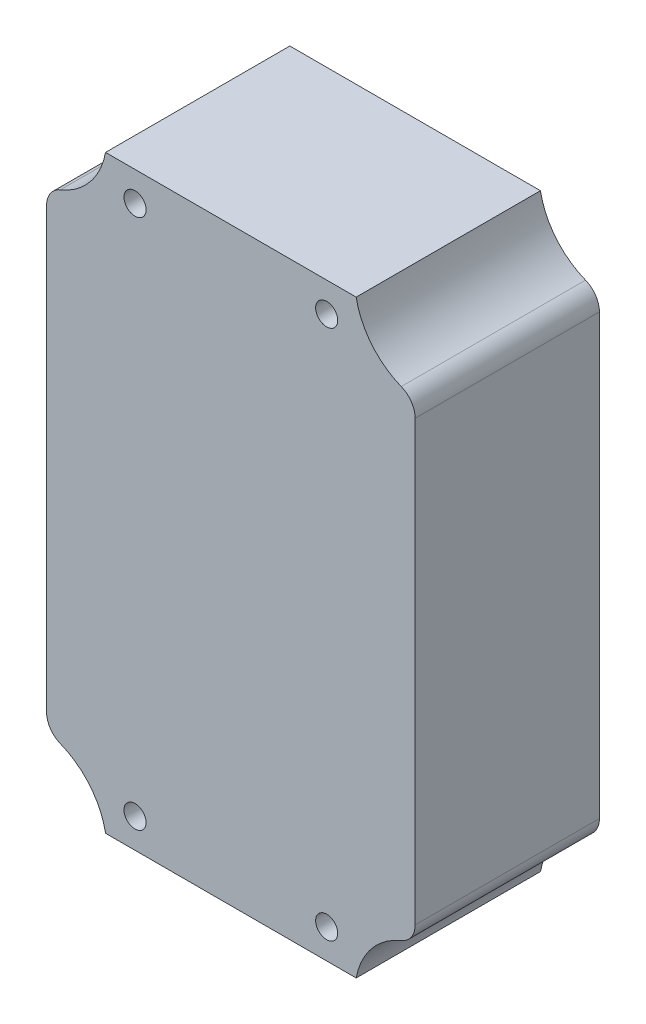
ISO-10303-21;
HEADER;
FILE_DESCRIPTION(('STEP AP214'),'2;1');
FILE_NAME('part.step','',(''),(''),'','','');
FILE_SCHEMA(('AUTOMOTIVE_DESIGN { 1 0 10303 214 1 1 1 1 }'));
ENDSEC;
DATA;
#1=APPLICATION_CONTEXT('core data for automotive mechanical design processes');
#2=APPLICATION_PROTOCOL_DEFINITION('international standard','automotive_design',2000,#1);
#3=PRODUCT_CONTEXT('',#1,'mechanical');
#4=PRODUCT('Part','Part','',(#3));
#5=PRODUCT_RELATED_PRODUCT_CATEGORY('part','',(#4));
#6=PRODUCT_DEFINITION_FORMATION('','',#4);
#7=PRODUCT_DEFINITION_CONTEXT('part definition',#1,'design');
#8=PRODUCT_DEFINITION('design','',#6,#7);
#9=PRODUCT_DEFINITION_SHAPE('','',#8);
#10=(LENGTH_UNIT() NAMED_UNIT(*) SI_UNIT(.MILLI.,.METRE.));
#11=(NAMED_UNIT(*) PLANE_ANGLE_UNIT() SI_UNIT($,.RADIAN.));
#12=(NAMED_UNIT(*) SI_UNIT($,.STERADIAN.) SOLID_ANGLE_UNIT());
#13=UNCERTAINTY_MEASURE_WITH_UNIT(LENGTH_MEASURE(1.E-05),#10,'distance_accuracy_value','');
#14=(GEOMETRIC_REPRESENTATION_CONTEXT(3) GLOBAL_UNCERTAINTY_ASSIGNED_CONTEXT((#13)) GLOBAL_UNIT_ASSIGNED_CONTEXT((#10,
#11,#12)) REPRESENTATION_CONTEXT('',''));
#15=CARTESIAN_POINT('',(0.,0.,0.));
#16=DIRECTION('',(0.,0.,1.));
#17=DIRECTION('',(1.,0.,0.));
#18=AXIS2_PLACEMENT_3D('',#15,#16,#17);
#19=CARTESIAN_POINT('',(0.,0.,25.));
#20=DIRECTION('',(0.,0.,1.));
#21=DIRECTION('',(1.,0.,0.));
#22=AXIS2_PLACEMENT_3D('',#19,#20,#21);
#23=PLANE('',#22);
#24=CARTESIAN_POINT('',(-13.,-36.,25.));
#25=DIRECTION('',(0.,0.,1.));
#26=DIRECTION('',(-1.,0.,0.));
#27=AXIS2_PLACEMENT_3D('',#24,#25,#26);
#28=CIRCLE('',#27,1.5);
#29=CARTESIAN_POINT('',(-14.5,-36.,25.));
#30=VERTEX_POINT('',#29);
#31=EDGE_CURVE('E258',#30,#30,#28,.T.);
#32=ORIENTED_EDGE('',*,*,#31,.F.);
#33=EDGE_LOOP('',(#32));
#34=FACE_BOUND('',#33,.T.);
#35=CARTESIAN_POINT('',(-13.,36.,25.));
#36=DIRECTION('',(0.,0.,1.));
#37=DIRECTION('',(1.,0.,0.));
#38=AXIS2_PLACEMENT_3D('',#35,#36,#37);
#39=CIRCLE('',#38,1.5);
#40=CARTESIAN_POINT('',(-11.5,36.,25.));
#41=VERTEX_POINT('',#40);
#42=EDGE_CURVE('E219',#41,#41,#39,.T.);
#43=ORIENTED_EDGE('',*,*,#42,.F.);
#44=EDGE_LOOP('',(#43));
#45=FACE_BOUND('',#44,.T.);
#46=CARTESIAN_POINT('',(26.8309518948453,-41.8309518948453,25.));
#47=DIRECTION('',(0.,0.,1.));
#48=DIRECTION('',(1.,0.,0.));
#49=AXIS2_PLACEMENT_3D('',#46,#47,#48);
#50=CIRCLE('',#49,10.);
#51=CARTESIAN_POINT('',(17.,-40.,25.));
#52=VERTEX_POINT('',#51);
#53=CARTESIAN_POINT('',(23.1148350526566,-32.5470693226021,25.));
#54=VERTEX_POINT('',#53);
#55=EDGE_CURVE('E165',#52,#54,#50,.F.);
#56=ORIENTED_EDGE('',*,*,#55,.T.);
#57=CARTESIAN_POINT('',(22.,-29.7619045509291,25.));
#58=DIRECTION('',(0.,0.,1.));
#59=DIRECTION('',(1.,0.,0.));
#60=AXIS2_PLACEMENT_3D('',#57,#58,#59);
#61=CIRCLE('',#60,3.);
#62=CARTESIAN_POINT('',(25.,-29.7619045509291,25.));
#63=VERTEX_POINT('',#62);
#64=EDGE_CURVE('E186',#54,#63,#61,.T.);
#65=ORIENTED_EDGE('',*,*,#64,.T.);
#66=DIRECTION('',(0.,1.,0.));
#67=VECTOR('',#66,1.);
#68=CARTESIAN_POINT('',(25.,32.,25.));
#69=LINE('',#68,#67);
#70=CARTESIAN_POINT('',(25.,29.7619045509291,25.));
#71=VERTEX_POINT('',#70);
#72=EDGE_CURVE('E143',#63,#71,#69,.T.);
#73=ORIENTED_EDGE('',*,*,#72,.T.);
#74=CARTESIAN_POINT('',(22.,29.7619045509291,25.));
#75=DIRECTION('',(0.,0.,1.));
#76=DIRECTION('',(1.,0.,0.));
#77=AXIS2_PLACEMENT_3D('',#74,#75,#76);
#78=CIRCLE('',#77,3.);
#79=CARTESIAN_POINT('',(23.1148350526566,32.5470693226021,25.));
#80=VERTEX_POINT('',#79);
#81=EDGE_CURVE('E49',#71,#80,#78,.T.);
#82=ORIENTED_EDGE('',*,*,#81,.T.);
#83=CARTESIAN_POINT('',(26.8309518948453,41.8309518948453,25.));
#84=DIRECTION('',(0.,0.,1.));
#85=DIRECTION('',(1.,0.,0.));
#86=AXIS2_PLACEMENT_3D('',#83,#84,#85);
#87=CIRCLE('',#86,10.);
#88=CARTESIAN_POINT('',(17.,40.,25.));
#89=VERTEX_POINT('',#88);
#90=EDGE_CURVE('E151',#80,#89,#87,.F.);
#91=ORIENTED_EDGE('',*,*,#90,.T.);
#92=DIRECTION('',(-1.,0.,0.));
#93=VECTOR('',#92,1.);
#94=CARTESIAN_POINT('',(-17.,40.,25.));
#95=LINE('',#94,#93);
#96=CARTESIAN_POINT('',(-17.,40.,25.));
#97=VERTEX_POINT('',#96);
#98=EDGE_CURVE('E204',#89,#97,#95,.T.);
#99=ORIENTED_EDGE('',*,*,#98,.T.);
#100=CARTESIAN_POINT('',(-26.8309518948453,41.8309518948453,25.));
#101=DIRECTION('',(0.,0.,1.));
#102=DIRECTION('',(1.,0.,0.));
#103=AXIS2_PLACEMENT_3D('',#100,#101,#102);
#104=CIRCLE('',#103,10.);
#105=CARTESIAN_POINT('',(-23.1148350526566,32.5470693226021,25.));
#106=VERTEX_POINT('',#105);
#107=EDGE_CURVE('E160',#97,#106,#104,.F.);
#108=ORIENTED_EDGE('',*,*,#107,.T.);
#109=CARTESIAN_POINT('',(-22.,29.7619045509291,25.));
#110=DIRECTION('',(0.,0.,1.));
#111=DIRECTION('',(1.,0.,0.));
#112=AXIS2_PLACEMENT_3D('',#109,#110,#111);
#113=CIRCLE('',#112,3.);
#114=CARTESIAN_POINT('',(-25.,29.7619045509291,25.));
#115=VERTEX_POINT('',#114);
#116=EDGE_CURVE('E183',#106,#115,#113,.T.);
#117=ORIENTED_EDGE('',*,*,#116,.T.);
#118=DIRECTION('',(0.,-1.,0.));
#119=VECTOR('',#118,1.);
#120=CARTESIAN_POINT('',(-25.,32.,25.));
#121=LINE('',#120,#119);
#122=CARTESIAN_POINT('',(-25.,-29.7619045509291,25.));
#123=VERTEX_POINT('',#122);
#124=EDGE_CURVE('E144',#115,#123,#121,.T.);
#125=ORIENTED_EDGE('',*,*,#124,.T.);
#126=CARTESIAN_POINT('',(-22.,-29.7619045509291,25.));
#127=DIRECTION('',(0.,0.,1.));
#128=DIRECTION('',(1.,0.,0.));
#129=AXIS2_PLACEMENT_3D('',#126,#127,#128);
#130=CIRCLE('',#129,3.);
#131=CARTESIAN_POINT('',(-23.1148350526566,-32.5470693226021,25.));
#132=VERTEX_POINT('',#131);
#133=EDGE_CURVE('E56',#123,#132,#130,.T.);
#134=ORIENTED_EDGE('',*,*,#133,.T.);
#135=CARTESIAN_POINT('',(-26.8309518948453,-41.8309518948453,25.));
#136=DIRECTION('',(0.,0.,1.));
#137=DIRECTION('',(1.,0.,0.));
#138=AXIS2_PLACEMENT_3D('',#135,#136,#137);
#139=CIRCLE('',#138,10.);
#140=CARTESIAN_POINT('',(-17.,-40.,25.));
#141=VERTEX_POINT('',#140);
#142=EDGE_CURVE('E121',#132,#141,#139,.F.);
#143=ORIENTED_EDGE('',*,*,#142,.T.);
#144=DIRECTION('',(1.,0.,0.));
#145=VECTOR('',#144,1.);
#146=CARTESIAN_POINT('',(-17.,-40.,25.));
#147=LINE('',#146,#145);
#148=EDGE_CURVE('E125',#141,#52,#147,.T.);
#149=ORIENTED_EDGE('',*,*,#148,.T.);
#150=EDGE_LOOP('',(#56,#65,#73,#82,#91,#99,#108,#117,#125,#134,#143,#149));
#151=FACE_BOUND('',#150,.T.);
#152=CARTESIAN_POINT('',(13.,36.,25.));
#153=DIRECTION('',(0.,0.,1.));
#154=DIRECTION('',(-1.,0.,0.));
#155=AXIS2_PLACEMENT_3D('',#152,#153,#154);
#156=CIRCLE('',#155,1.5);
#157=CARTESIAN_POINT('',(11.5,36.,25.));
#158=VERTEX_POINT('',#157);
#159=EDGE_CURVE('E253',#158,#158,#156,.T.);
#160=ORIENTED_EDGE('',*,*,#159,.F.);
#161=EDGE_LOOP('',(#160));
#162=FACE_BOUND('',#161,.T.);
#163=CARTESIAN_POINT('',(13.,-36.,25.));
#164=DIRECTION('',(0.,0.,1.));
#165=DIRECTION('',(1.,0.,0.));
#166=AXIS2_PLACEMENT_3D('',#163,#164,#165);
#167=CIRCLE('',#166,1.5);
#168=CARTESIAN_POINT('',(14.5,-36.,25.));
#169=VERTEX_POINT('',#168);
#170=EDGE_CURVE('E264',#169,#169,#167,.T.);
#171=ORIENTED_EDGE('',*,*,#170,.F.);
#172=EDGE_LOOP('',(#171));
#173=FACE_BOUND('',#172,.T.);
#174=ADVANCED_FACE('F34',(#34,#45,#151,#162,#173),#23,.T.);
#175=CARTESIAN_POINT('',(0.,0.,0.));
#176=DIRECTION('',(0.,0.,1.));
#177=DIRECTION('',(1.,0.,0.));
#178=AXIS2_PLACEMENT_3D('',#175,#176,#177);
#179=PLANE('',#178);
#180=DIRECTION('',(0.,1.,0.));
#181=VECTOR('',#180,1.);
#182=CARTESIAN_POINT('',(25.,32.,0.));
#183=LINE('',#182,#181);
#184=CARTESIAN_POINT('',(25.,-29.7619045509291,0.));
#185=VERTEX_POINT('',#184);
#186=CARTESIAN_POINT('',(25.,29.7619045509291,0.));
#187=VERTEX_POINT('',#186);
#188=EDGE_CURVE('E221',#185,#187,#183,.T.);
#189=ORIENTED_EDGE('',*,*,#188,.F.);
#190=CARTESIAN_POINT('',(22.,-29.7619045509291,0.));
#191=DIRECTION('',(0.,0.,1.));
#192=DIRECTION('',(1.,0.,0.));
#193=AXIS2_PLACEMENT_3D('',#190,#191,#192);
#194=CIRCLE('',#193,3.);
#195=CARTESIAN_POINT('',(23.1148350526566,-32.5470693226021,0.));
#196=VERTEX_POINT('',#195);
#197=EDGE_CURVE('E178',#185,#196,#194,.F.);
#198=ORIENTED_EDGE('',*,*,#197,.T.);
#199=CARTESIAN_POINT('',(26.8309518948453,-41.8309518948453,0.));
#200=DIRECTION('',(0.,0.,1.));
#201=DIRECTION('',(1.,0.,0.));
#202=AXIS2_PLACEMENT_3D('',#199,#200,#201);
#203=CIRCLE('',#202,10.);
#204=CARTESIAN_POINT('',(17.,-40.,0.));
#205=VERTEX_POINT('',#204);
#206=EDGE_CURVE('E163',#196,#205,#203,.T.);
#207=ORIENTED_EDGE('',*,*,#206,.T.);
#208=DIRECTION('',(1.,0.,0.));
#209=VECTOR('',#208,1.);
#210=CARTESIAN_POINT('',(-17.,-40.,0.));
#211=LINE('',#210,#209);
#212=CARTESIAN_POINT('',(-17.,-40.,0.));
#213=VERTEX_POINT('',#212);
#214=EDGE_CURVE('E218',#213,#205,#211,.T.);
#215=ORIENTED_EDGE('',*,*,#214,.F.);
#216=CARTESIAN_POINT('',(-26.8309518948453,-41.8309518948453,0.));
#217=DIRECTION('',(0.,0.,1.));
#218=DIRECTION('',(1.,0.,0.));
#219=AXIS2_PLACEMENT_3D('',#216,#217,#218);
#220=CIRCLE('',#219,10.);
#221=CARTESIAN_POINT('',(-23.1148350526566,-32.5470693226021,0.));
#222=VERTEX_POINT('',#221);
#223=EDGE_CURVE('E132',#213,#222,#220,.T.);
#224=ORIENTED_EDGE('',*,*,#223,.T.);
#225=CARTESIAN_POINT('',(-22.,-29.7619045509291,0.));
#226=DIRECTION('',(0.,0.,1.));
#227=DIRECTION('',(1.,0.,0.));
#228=AXIS2_PLACEMENT_3D('',#225,#226,#227);
#229=CIRCLE('',#228,3.);
#230=CARTESIAN_POINT('',(-25.,-29.7619045509291,0.));
#231=VERTEX_POINT('',#230);
#232=EDGE_CURVE('E176',#222,#231,#229,.F.);
#233=ORIENTED_EDGE('',*,*,#232,.T.);
#234=DIRECTION('',(0.,-1.,0.));
#235=VECTOR('',#234,1.);
#236=CARTESIAN_POINT('',(-25.,32.,0.));
#237=LINE('',#236,#235);
#238=CARTESIAN_POINT('',(-25.,29.7619045509291,0.));
#239=VERTEX_POINT('',#238);
#240=EDGE_CURVE('E212',#239,#231,#237,.T.);
#241=ORIENTED_EDGE('',*,*,#240,.F.);
#242=CARTESIAN_POINT('',(-22.,29.7619045509291,0.));
#243=DIRECTION('',(0.,0.,1.));
#244=DIRECTION('',(1.,0.,0.));
#245=AXIS2_PLACEMENT_3D('',#242,#243,#244);
#246=CIRCLE('',#245,3.);
#247=CARTESIAN_POINT('',(-23.1148350526566,32.5470693226021,0.));
#248=VERTEX_POINT('',#247);
#249=EDGE_CURVE('E174',#239,#248,#246,.F.);
#250=ORIENTED_EDGE('',*,*,#249,.T.);
#251=CARTESIAN_POINT('',(-26.8309518948453,41.8309518948453,0.));
#252=DIRECTION('',(0.,0.,1.));
#253=DIRECTION('',(1.,0.,0.));
#254=AXIS2_PLACEMENT_3D('',#251,#252,#253);
#255=CIRCLE('',#254,10.);
#256=CARTESIAN_POINT('',(-17.,40.,0.));
#257=VERTEX_POINT('',#256);
#258=EDGE_CURVE('E158',#248,#257,#255,.T.);
#259=ORIENTED_EDGE('',*,*,#258,.T.);
#260=DIRECTION('',(-1.,0.,0.));
#261=VECTOR('',#260,1.);
#262=CARTESIAN_POINT('',(-17.,40.,0.));
#263=LINE('',#262,#261);
#264=CARTESIAN_POINT('',(17.,40.,0.));
#265=VERTEX_POINT('',#264);
#266=EDGE_CURVE('E231',#265,#257,#263,.T.);
#267=ORIENTED_EDGE('',*,*,#266,.F.);
#268=CARTESIAN_POINT('',(26.8309518948453,41.8309518948453,0.));
#269=DIRECTION('',(0.,0.,1.));
#270=DIRECTION('',(1.,0.,0.));
#271=AXIS2_PLACEMENT_3D('',#268,#269,#270);
#272=CIRCLE('',#271,10.);
#273=CARTESIAN_POINT('',(23.1148350526566,32.5470693226021,0.));
#274=VERTEX_POINT('',#273);
#275=EDGE_CURVE('E148',#265,#274,#272,.T.);
#276=ORIENTED_EDGE('',*,*,#275,.T.);
#277=CARTESIAN_POINT('',(22.,29.7619045509291,0.));
#278=DIRECTION('',(0.,0.,1.));
#279=DIRECTION('',(1.,0.,0.));
#280=AXIS2_PLACEMENT_3D('',#277,#278,#279);
#281=CIRCLE('',#280,3.);
#282=EDGE_CURVE('E172',#274,#187,#281,.F.);
#283=ORIENTED_EDGE('',*,*,#282,.T.);
#284=EDGE_LOOP('',(#189,#198,#207,#215,#224,#233,#241,#250,#259,#267,#276,#283));
#285=FACE_BOUND('',#284,.T.);
#286=CARTESIAN_POINT('',(-13.,36.,0.));
#287=DIRECTION('',(0.,0.,1.));
#288=DIRECTION('',(1.,0.,0.));
#289=AXIS2_PLACEMENT_3D('',#286,#287,#288);
#290=CIRCLE('',#289,1.5);
#291=CARTESIAN_POINT('',(-11.5,36.,0.));
#292=VERTEX_POINT('',#291);
#293=EDGE_CURVE('E224',#292,#292,#290,.T.);
#294=ORIENTED_EDGE('',*,*,#293,.T.);
#295=EDGE_LOOP('',(#294));
#296=FACE_BOUND('',#295,.T.);
#297=CARTESIAN_POINT('',(13.,36.,0.));
#298=DIRECTION('',(0.,0.,1.));
#299=DIRECTION('',(-1.,0.,0.));
#300=AXIS2_PLACEMENT_3D('',#297,#298,#299);
#301=CIRCLE('',#300,1.5);
#302=CARTESIAN_POINT('',(11.5,36.,0.));
#303=VERTEX_POINT('',#302);
#304=EDGE_CURVE('E255',#303,#303,#301,.T.);
#305=ORIENTED_EDGE('',*,*,#304,.T.);
#306=EDGE_LOOP('',(#305));
#307=FACE_BOUND('',#306,.T.);
#308=CARTESIAN_POINT('',(-13.,-36.,0.));
#309=DIRECTION('',(0.,0.,1.));
#310=DIRECTION('',(-1.,0.,0.));
#311=AXIS2_PLACEMENT_3D('',#308,#309,#310);
#312=CIRCLE('',#311,1.5);
#313=CARTESIAN_POINT('',(-14.5,-36.,0.));
#314=VERTEX_POINT('',#313);
#315=EDGE_CURVE('E261',#314,#314,#312,.T.);
#316=ORIENTED_EDGE('',*,*,#315,.T.);
#317=EDGE_LOOP('',(#316));
#318=FACE_BOUND('',#317,.T.);
#319=CARTESIAN_POINT('',(13.,-36.,0.));
#320=DIRECTION('',(0.,0.,1.));
#321=DIRECTION('',(1.,0.,0.));
#322=AXIS2_PLACEMENT_3D('',#319,#320,#321);
#323=CIRCLE('',#322,1.5);
#324=CARTESIAN_POINT('',(14.5,-36.,0.));
#325=VERTEX_POINT('',#324);
#326=EDGE_CURVE('E267',#325,#325,#323,.T.);
#327=ORIENTED_EDGE('',*,*,#326,.T.);
#328=EDGE_LOOP('',(#327));
#329=FACE_BOUND('',#328,.T.);
#330=ADVANCED_FACE('F216',(#285,#296,#307,#318,#329),#179,.F.);
#331=CARTESIAN_POINT('',(-25.,32.,25.));
#332=DIRECTION('',(1.,0.,0.));
#333=DIRECTION('',(0.,1.,0.));
#334=AXIS2_PLACEMENT_3D('',#331,#332,#333);
#335=PLANE('',#334);
#336=ORIENTED_EDGE('',*,*,#240,.T.);
#337=DIRECTION('',(0.,0.,1.));
#338=VECTOR('',#337,1.);
#339=CARTESIAN_POINT('',(-25.,-29.7619045509291,25.));
#340=LINE('',#339,#338);
#341=EDGE_CURVE('E193',#231,#123,#340,.T.);
#342=ORIENTED_EDGE('',*,*,#341,.T.);
#343=ORIENTED_EDGE('',*,*,#124,.F.);
#344=DIRECTION('',(0.,0.,1.));
#345=VECTOR('',#344,1.);
#346=CARTESIAN_POINT('',(-25.,29.7619045509291,25.));
#347=LINE('',#346,#345);
#348=EDGE_CURVE('E190',#115,#239,#347,.F.);
#349=ORIENTED_EDGE('',*,*,#348,.T.);
#350=EDGE_LOOP('',(#336,#342,#343,#349));
#351=FACE_BOUND('',#350,.T.);
#352=ADVANCED_FACE('F211',(#351),#335,.F.);
#353=CARTESIAN_POINT('',(-17.,-40.,25.));
#354=DIRECTION('',(0.,1.,0.));
#355=DIRECTION('',(0.,0.,1.));
#356=AXIS2_PLACEMENT_3D('',#353,#354,#355);
#357=PLANE('',#356);
#358=ORIENTED_EDGE('',*,*,#214,.T.);
#359=DIRECTION('',(0.,0.,-1.));
#360=VECTOR('',#359,1.);
#361=CARTESIAN_POINT('',(17.,-40.,25.));
#362=LINE('',#361,#360);
#363=EDGE_CURVE('E141',#52,#205,#362,.T.);
#364=ORIENTED_EDGE('',*,*,#363,.F.);
#365=ORIENTED_EDGE('',*,*,#148,.F.);
#366=DIRECTION('',(0.,0.,-1.));
#367=VECTOR('',#366,1.);
#368=CARTESIAN_POINT('',(-17.,-40.,25.));
#369=LINE('',#368,#367);
#370=EDGE_CURVE('E138',#141,#213,#369,.T.);
#371=ORIENTED_EDGE('',*,*,#370,.T.);
#372=EDGE_LOOP('',(#358,#364,#365,#371));
#373=FACE_BOUND('',#372,.T.);
#374=ADVANCED_FACE('F137',(#373),#357,.F.);
#375=CARTESIAN_POINT('',(25.,32.,25.));
#376=DIRECTION('',(-1.,0.,0.));
#377=DIRECTION('',(0.,-1.,0.));
#378=AXIS2_PLACEMENT_3D('',#375,#376,#377);
#379=PLANE('',#378);
#380=ORIENTED_EDGE('',*,*,#72,.F.);
#381=DIRECTION('',(0.,0.,1.));
#382=VECTOR('',#381,1.);
#383=CARTESIAN_POINT('',(25.,-29.7619045509291,25.));
#384=LINE('',#383,#382);
#385=EDGE_CURVE('E169',#63,#185,#384,.F.);
#386=ORIENTED_EDGE('',*,*,#385,.T.);
#387=ORIENTED_EDGE('',*,*,#188,.T.);
#388=DIRECTION('',(0.,0.,1.));
#389=VECTOR('',#388,1.);
#390=CARTESIAN_POINT('',(25.,29.7619045509291,25.));
#391=LINE('',#390,#389);
#392=EDGE_CURVE('E131',#187,#71,#391,.T.);
#393=ORIENTED_EDGE('',*,*,#392,.T.);
#394=EDGE_LOOP('',(#380,#386,#387,#393));
#395=FACE_BOUND('',#394,.T.);
#396=ADVANCED_FACE('F247',(#395),#379,.F.);
#397=CARTESIAN_POINT('',(-17.,40.,25.));
#398=DIRECTION('',(0.,-1.,0.));
#399=DIRECTION('',(0.,0.,-1.));
#400=AXIS2_PLACEMENT_3D('',#397,#398,#399);
#401=PLANE('',#400);
#402=ORIENTED_EDGE('',*,*,#266,.T.);
#403=DIRECTION('',(0.,0.,-1.));
#404=VECTOR('',#403,1.);
#405=CARTESIAN_POINT('',(-17.,40.,25.));
#406=LINE('',#405,#404);
#407=EDGE_CURVE('E234',#97,#257,#406,.T.);
#408=ORIENTED_EDGE('',*,*,#407,.F.);
#409=ORIENTED_EDGE('',*,*,#98,.F.);
#410=DIRECTION('',(0.,0.,-1.));
#411=VECTOR('',#410,1.);
#412=CARTESIAN_POINT('',(17.,40.,25.));
#413=LINE('',#412,#411);
#414=EDGE_CURVE('E153',#89,#265,#413,.T.);
#415=ORIENTED_EDGE('',*,*,#414,.T.);
#416=EDGE_LOOP('',(#402,#408,#409,#415));
#417=FACE_BOUND('',#416,.T.);
#418=ADVANCED_FACE('F239',(#417),#401,.F.);
#419=CARTESIAN_POINT('',(-13.,36.,25.));
#420=DIRECTION('',(0.,0.,-1.));
#421=DIRECTION('',(-1.,0.,0.));
#422=AXIS2_PLACEMENT_3D('',#419,#420,#421);
#423=CYLINDRICAL_SURFACE('',#422,1.5);
#424=ORIENTED_EDGE('',*,*,#42,.T.);
#425=EDGE_LOOP('',(#424));
#426=FACE_BOUND('',#425,.T.);
#427=ORIENTED_EDGE('',*,*,#293,.F.);
#428=EDGE_LOOP('',(#427));
#429=FACE_BOUND('',#428,.T.);
#430=ADVANCED_FACE('F286',(#426,#429),#423,.F.);
#431=CARTESIAN_POINT('',(13.,36.,25.));
#432=DIRECTION('',(0.,0.,-1.));
#433=DIRECTION('',(-1.,0.,0.));
#434=AXIS2_PLACEMENT_3D('',#431,#432,#433);
#435=CYLINDRICAL_SURFACE('',#434,1.5);
#436=ORIENTED_EDGE('',*,*,#159,.T.);
#437=EDGE_LOOP('',(#436));
#438=FACE_BOUND('',#437,.T.);
#439=ORIENTED_EDGE('',*,*,#304,.F.);
#440=EDGE_LOOP('',(#439));
#441=FACE_BOUND('',#440,.T.);
#442=ADVANCED_FACE('F414',(#438,#441),#435,.F.);
#443=CARTESIAN_POINT('',(-13.,-36.,25.));
#444=DIRECTION('',(0.,0.,-1.));
#445=DIRECTION('',(-1.,0.,0.));
#446=AXIS2_PLACEMENT_3D('',#443,#444,#445);
#447=CYLINDRICAL_SURFACE('',#446,1.5);
#448=ORIENTED_EDGE('',*,*,#31,.T.);
#449=EDGE_LOOP('',(#448));
#450=FACE_BOUND('',#449,.T.);
#451=ORIENTED_EDGE('',*,*,#315,.F.);
#452=EDGE_LOOP('',(#451));
#453=FACE_BOUND('',#452,.T.);
#454=ADVANCED_FACE('F405',(#450,#453),#447,.F.);
#455=CARTESIAN_POINT('',(13.,-36.,25.));
#456=DIRECTION('',(0.,0.,-1.));
#457=DIRECTION('',(-1.,0.,0.));
#458=AXIS2_PLACEMENT_3D('',#455,#456,#457);
#459=CYLINDRICAL_SURFACE('',#458,1.5);
#460=ORIENTED_EDGE('',*,*,#170,.T.);
#461=EDGE_LOOP('',(#460));
#462=FACE_BOUND('',#461,.T.);
#463=ORIENTED_EDGE('',*,*,#326,.F.);
#464=EDGE_LOOP('',(#463));
#465=FACE_BOUND('',#464,.T.);
#466=ADVANCED_FACE('F273',(#462,#465),#459,.F.);
#467=CARTESIAN_POINT('',(26.8309518948453,41.8309518948453,25.));
#468=DIRECTION('',(0.,0.,1.));
#469=DIRECTION('',(1.,0.,0.));
#470=AXIS2_PLACEMENT_3D('',#467,#468,#469);
#471=CYLINDRICAL_SURFACE('',#470,10.);
#472=ORIENTED_EDGE('',*,*,#90,.F.);
#473=DIRECTION('',(0.,0.,1.));
#474=VECTOR('',#473,1.);
#475=CARTESIAN_POINT('',(23.1148350526566,32.5470693226021,25.));
#476=LINE('',#475,#474);
#477=EDGE_CURVE('E11',#80,#274,#476,.F.);
#478=ORIENTED_EDGE('',*,*,#477,.T.);
#479=ORIENTED_EDGE('',*,*,#275,.F.);
#480=ORIENTED_EDGE('',*,*,#414,.F.);
#481=EDGE_LOOP('',(#472,#478,#479,#480));
#482=FACE_BOUND('',#481,.T.);
#483=ADVANCED_FACE('F241',(#482),#471,.F.);
#484=CARTESIAN_POINT('',(-26.8309518948453,41.8309518948453,25.));
#485=DIRECTION('',(0.,0.,1.));
#486=DIRECTION('',(1.,0.,0.));
#487=AXIS2_PLACEMENT_3D('',#484,#485,#486);
#488=CYLINDRICAL_SURFACE('',#487,10.);
#489=ORIENTED_EDGE('',*,*,#258,.F.);
#490=DIRECTION('',(0.,0.,1.));
#491=VECTOR('',#490,1.);
#492=CARTESIAN_POINT('',(-23.1148350526566,32.5470693226021,25.));
#493=LINE('',#492,#491);
#494=EDGE_CURVE('E42',#248,#106,#493,.T.);
#495=ORIENTED_EDGE('',*,*,#494,.T.);
#496=ORIENTED_EDGE('',*,*,#107,.F.);
#497=ORIENTED_EDGE('',*,*,#407,.T.);
#498=EDGE_LOOP('',(#489,#495,#496,#497));
#499=FACE_BOUND('',#498,.T.);
#500=ADVANCED_FACE('F198',(#499),#488,.F.);
#501=CARTESIAN_POINT('',(26.8309518948453,-41.8309518948453,25.));
#502=DIRECTION('',(0.,0.,1.));
#503=DIRECTION('',(1.,0.,0.));
#504=AXIS2_PLACEMENT_3D('',#501,#502,#503);
#505=CYLINDRICAL_SURFACE('',#504,10.);
#506=ORIENTED_EDGE('',*,*,#206,.F.);
#507=DIRECTION('',(0.,0.,1.));
#508=VECTOR('',#507,1.);
#509=CARTESIAN_POINT('',(23.1148350526566,-32.5470693226021,25.));
#510=LINE('',#509,#508);
#511=EDGE_CURVE('E180',#196,#54,#510,.T.);
#512=ORIENTED_EDGE('',*,*,#511,.T.);
#513=ORIENTED_EDGE('',*,*,#55,.F.);
#514=ORIENTED_EDGE('',*,*,#363,.T.);
#515=EDGE_LOOP('',(#506,#512,#513,#514));
#516=FACE_BOUND('',#515,.T.);
#517=ADVANCED_FACE('F301',(#516),#505,.F.);
#518=CARTESIAN_POINT('',(-26.8309518948453,-41.8309518948453,25.));
#519=DIRECTION('',(0.,0.,1.));
#520=DIRECTION('',(1.,0.,0.));
#521=AXIS2_PLACEMENT_3D('',#518,#519,#520);
#522=CYLINDRICAL_SURFACE('',#521,10.);
#523=ORIENTED_EDGE('',*,*,#142,.F.);
#524=DIRECTION('',(0.,0.,1.));
#525=VECTOR('',#524,1.);
#526=CARTESIAN_POINT('',(-23.1148350526566,-32.5470693226021,25.));
#527=LINE('',#526,#525);
#528=EDGE_CURVE('E188',#132,#222,#527,.F.);
#529=ORIENTED_EDGE('',*,*,#528,.T.);
#530=ORIENTED_EDGE('',*,*,#223,.F.);
#531=ORIENTED_EDGE('',*,*,#370,.F.);
#532=EDGE_LOOP('',(#523,#529,#530,#531));
#533=FACE_BOUND('',#532,.T.);
#534=ADVANCED_FACE('F146',(#533),#522,.F.);
#535=CARTESIAN_POINT('',(22.,-29.7619045509291,25.));
#536=DIRECTION('',(0.,0.,1.));
#537=DIRECTION('',(1.,0.,0.));
#538=AXIS2_PLACEMENT_3D('',#535,#536,#537);
#539=CYLINDRICAL_SURFACE('',#538,3.);
#540=ORIENTED_EDGE('',*,*,#64,.F.);
#541=ORIENTED_EDGE('',*,*,#511,.F.);
#542=ORIENTED_EDGE('',*,*,#197,.F.);
#543=ORIENTED_EDGE('',*,*,#385,.F.);
#544=EDGE_LOOP('',(#540,#541,#542,#543));
#545=FACE_BOUND('',#544,.T.);
#546=ADVANCED_FACE('F307',(#545),#539,.T.);
#547=CARTESIAN_POINT('',(-22.,-29.7619045509291,25.));
#548=DIRECTION('',(0.,0.,1.));
#549=DIRECTION('',(1.,0.,0.));
#550=AXIS2_PLACEMENT_3D('',#547,#548,#549);
#551=CYLINDRICAL_SURFACE('',#550,3.);
#552=ORIENTED_EDGE('',*,*,#133,.F.);
#553=ORIENTED_EDGE('',*,*,#341,.F.);
#554=ORIENTED_EDGE('',*,*,#232,.F.);
#555=ORIENTED_EDGE('',*,*,#528,.F.);
#556=EDGE_LOOP('',(#552,#553,#554,#555));
#557=FACE_BOUND('',#556,.T.);
#558=ADVANCED_FACE('F310',(#557),#551,.T.);
#559=CARTESIAN_POINT('',(-22.,29.7619045509291,25.));
#560=DIRECTION('',(0.,0.,1.));
#561=DIRECTION('',(1.,0.,0.));
#562=AXIS2_PLACEMENT_3D('',#559,#560,#561);
#563=CYLINDRICAL_SURFACE('',#562,3.);
#564=ORIENTED_EDGE('',*,*,#116,.F.);
#565=ORIENTED_EDGE('',*,*,#494,.F.);
#566=ORIENTED_EDGE('',*,*,#249,.F.);
#567=ORIENTED_EDGE('',*,*,#348,.F.);
#568=EDGE_LOOP('',(#564,#565,#566,#567));
#569=FACE_BOUND('',#568,.T.);
#570=ADVANCED_FACE('F207',(#569),#563,.T.);
#571=CARTESIAN_POINT('',(22.,29.7619045509291,25.));
#572=DIRECTION('',(0.,0.,1.));
#573=DIRECTION('',(1.,0.,0.));
#574=AXIS2_PLACEMENT_3D('',#571,#572,#573);
#575=CYLINDRICAL_SURFACE('',#574,3.);
#576=ORIENTED_EDGE('',*,*,#81,.F.);
#577=ORIENTED_EDGE('',*,*,#392,.F.);
#578=ORIENTED_EDGE('',*,*,#282,.F.);
#579=ORIENTED_EDGE('',*,*,#477,.F.);
#580=EDGE_LOOP('',(#576,#577,#578,#579));
#581=FACE_BOUND('',#580,.T.);
#582=ADVANCED_FACE('F36',(#581),#575,.T.);
#583=CLOSED_SHELL('',(#174,#330,#352,#374,#396,#418,#430,#442,#454,#466,#483,#500,#517,#534,
#546,#558,#570,#582));
#584=MANIFOLD_SOLID_BREP('B2',#583);
#585=ADVANCED_BREP_SHAPE_REPRESENTATION('',(#18,#584),#14);
#586=SHAPE_DEFINITION_REPRESENTATION(#9,#585);
ENDSEC;
END-ISO-10303-21;
